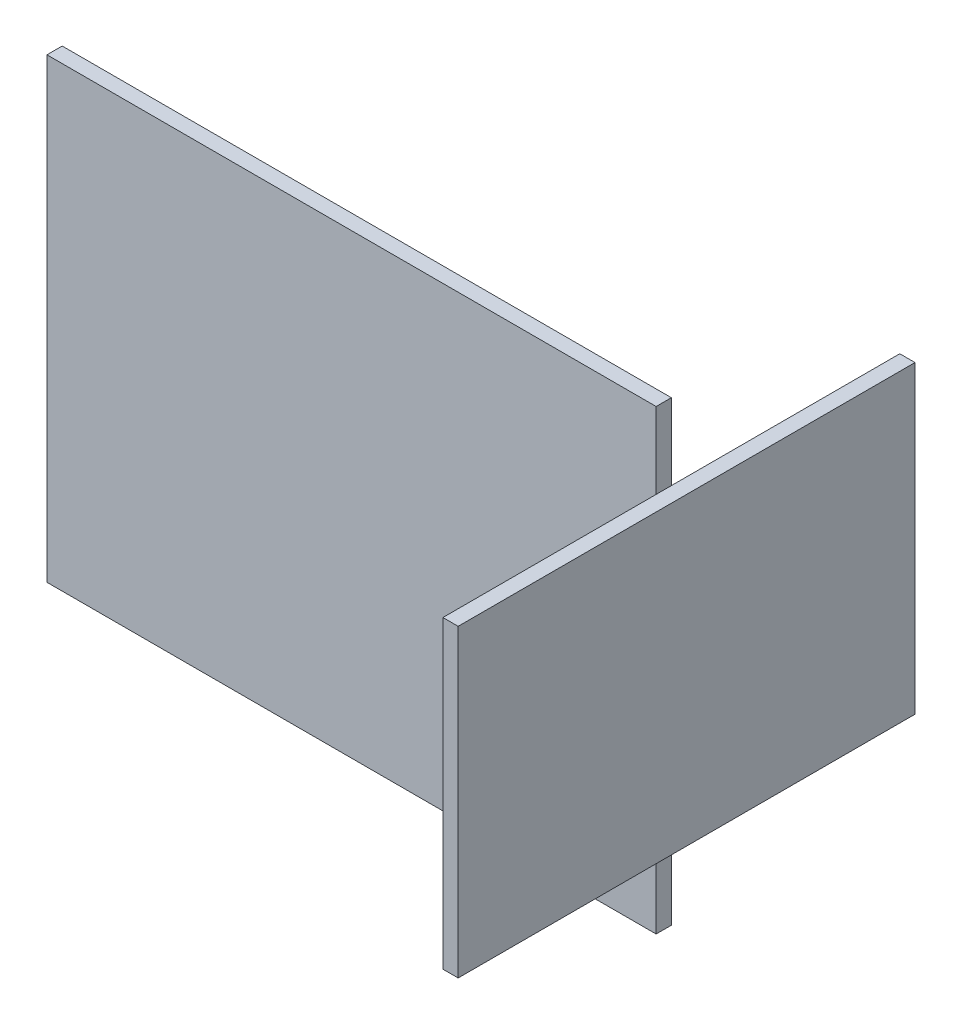
ISO-10303-21;
HEADER;
FILE_DESCRIPTION(('STEP AP214'),'2;1');
FILE_NAME('part.step','',(''),(''),'','','');
FILE_SCHEMA(('AUTOMOTIVE_DESIGN { 1 0 10303 214 1 1 1 1 }'));
ENDSEC;
DATA;
#1=APPLICATION_CONTEXT('core data for automotive mechanical design processes');
#2=APPLICATION_PROTOCOL_DEFINITION('international standard','automotive_design',2000,#1);
#3=PRODUCT_CONTEXT('',#1,'mechanical');
#4=PRODUCT('Part','Part','',(#3));
#5=PRODUCT_RELATED_PRODUCT_CATEGORY('part','',(#4));
#6=PRODUCT_DEFINITION_FORMATION('','',#4);
#7=PRODUCT_DEFINITION_CONTEXT('part definition',#1,'design');
#8=PRODUCT_DEFINITION('design','',#6,#7);
#9=PRODUCT_DEFINITION_SHAPE('','',#8);
#10=(LENGTH_UNIT() NAMED_UNIT(*) SI_UNIT(.MILLI.,.METRE.));
#11=(NAMED_UNIT(*) PLANE_ANGLE_UNIT() SI_UNIT($,.RADIAN.));
#12=(NAMED_UNIT(*) SI_UNIT($,.STERADIAN.) SOLID_ANGLE_UNIT());
#13=UNCERTAINTY_MEASURE_WITH_UNIT(LENGTH_MEASURE(1.E-05),#10,'distance_accuracy_value','');
#14=(GEOMETRIC_REPRESENTATION_CONTEXT(3) GLOBAL_UNCERTAINTY_ASSIGNED_CONTEXT((#13)) GLOBAL_UNIT_ASSIGNED_CONTEXT((#10,
#11,#12)) REPRESENTATION_CONTEXT('',''));
#15=CARTESIAN_POINT('',(0.,0.,0.));
#16=DIRECTION('',(0.,0.,1.));
#17=DIRECTION('',(1.,0.,0.));
#18=AXIS2_PLACEMENT_3D('',#15,#16,#17);
#19=CARTESIAN_POINT('',(40.,30.,2.));
#20=DIRECTION('',(-1.,0.,0.));
#21=DIRECTION('',(0.,0.,1.));
#22=AXIS2_PLACEMENT_3D('',#19,#20,#21);
#23=PLANE('',#22);
#24=DIRECTION('',(0.,0.,1.));
#25=VECTOR('',#24,1.);
#26=CARTESIAN_POINT('',(40.,20.,30.));
#27=LINE('',#26,#25);
#28=CARTESIAN_POINT('',(40.,20.,0.));
#29=VERTEX_POINT('',#28);
#30=CARTESIAN_POINT('',(40.,20.,2.));
#31=VERTEX_POINT('',#30);
#32=EDGE_CURVE('E11',#29,#31,#27,.T.);
#33=ORIENTED_EDGE('',*,*,#32,.F.);
#34=DIRECTION('',(0.,1.,0.));
#35=VECTOR('',#34,1.);
#36=CARTESIAN_POINT('',(40.,30.,0.));
#37=LINE('',#36,#35);
#38=CARTESIAN_POINT('',(40.,30.,0.));
#39=VERTEX_POINT('',#38);
#40=EDGE_CURVE('E161',#29,#39,#37,.T.);
#41=ORIENTED_EDGE('',*,*,#40,.T.);
#42=DIRECTION('',(0.,0.,-1.));
#43=VECTOR('',#42,1.);
#44=CARTESIAN_POINT('',(40.,30.,2.));
#45=LINE('',#44,#43);
#46=CARTESIAN_POINT('',(40.,30.,2.));
#47=VERTEX_POINT('',#46);
#48=EDGE_CURVE('E168',#47,#39,#45,.T.);
#49=ORIENTED_EDGE('',*,*,#48,.F.);
#50=DIRECTION('',(0.,1.,0.));
#51=VECTOR('',#50,1.);
#52=CARTESIAN_POINT('',(40.,30.,2.));
#53=LINE('',#52,#51);
#54=EDGE_CURVE('E52',#31,#47,#53,.T.);
#55=ORIENTED_EDGE('',*,*,#54,.F.);
#56=EDGE_LOOP('',(#33,#41,#49,#55));
#57=FACE_BOUND('',#56,.T.);
#58=ADVANCED_FACE('F33',(#57),#23,.F.);
#59=DIRECTION('',(0.,0.,-1.));
#60=VECTOR('',#59,1.);
#61=CARTESIAN_POINT('',(40.,-20.,30.));
#62=LINE('',#61,#60);
#63=CARTESIAN_POINT('',(40.,-20.,2.));
#64=VERTEX_POINT('',#63);
#65=CARTESIAN_POINT('',(40.,-20.,0.));
#66=VERTEX_POINT('',#65);
#67=EDGE_CURVE('E42',#64,#66,#62,.T.);
#68=ORIENTED_EDGE('',*,*,#67,.F.);
#69=CARTESIAN_POINT('',(40.,-30.,2.));
#70=VERTEX_POINT('',#69);
#71=EDGE_CURVE('E154',#70,#64,#53,.T.);
#72=ORIENTED_EDGE('',*,*,#71,.F.);
#73=DIRECTION('',(0.,0.,-1.));
#74=VECTOR('',#73,1.);
#75=CARTESIAN_POINT('',(40.,-30.,2.));
#76=LINE('',#75,#74);
#77=CARTESIAN_POINT('',(40.,-30.,0.));
#78=VERTEX_POINT('',#77);
#79=EDGE_CURVE('E170',#70,#78,#76,.T.);
#80=ORIENTED_EDGE('',*,*,#79,.T.);
#81=EDGE_CURVE('E162',#78,#66,#37,.T.);
#82=ORIENTED_EDGE('',*,*,#81,.T.);
#83=EDGE_LOOP('',(#68,#72,#80,#82));
#84=FACE_BOUND('',#83,.T.);
#85=ADVANCED_FACE('F227',(#84),#23,.F.);
#86=CARTESIAN_POINT('',(-40.,30.,2.));
#87=DIRECTION('',(1.,0.,0.));
#88=DIRECTION('',(0.,0.,-1.));
#89=AXIS2_PLACEMENT_3D('',#86,#87,#88);
#90=PLANE('',#89);
#91=DIRECTION('',(0.,-1.,0.));
#92=VECTOR('',#91,1.);
#93=CARTESIAN_POINT('',(-40.,30.,0.));
#94=LINE('',#93,#92);
#95=CARTESIAN_POINT('',(-40.,30.,0.));
#96=VERTEX_POINT('',#95);
#97=CARTESIAN_POINT('',(-40.,-30.,0.));
#98=VERTEX_POINT('',#97);
#99=EDGE_CURVE('E139',#96,#98,#94,.T.);
#100=ORIENTED_EDGE('',*,*,#99,.T.);
#101=DIRECTION('',(0.,0.,-1.));
#102=VECTOR('',#101,1.);
#103=CARTESIAN_POINT('',(-40.,-30.,2.));
#104=LINE('',#103,#102);
#105=CARTESIAN_POINT('',(-40.,-30.,2.));
#106=VERTEX_POINT('',#105);
#107=EDGE_CURVE('E37',#106,#98,#104,.T.);
#108=ORIENTED_EDGE('',*,*,#107,.F.);
#109=DIRECTION('',(0.,-1.,0.));
#110=VECTOR('',#109,1.);
#111=CARTESIAN_POINT('',(-40.,30.,2.));
#112=LINE('',#111,#110);
#113=CARTESIAN_POINT('',(-40.,30.,2.));
#114=VERTEX_POINT('',#113);
#115=EDGE_CURVE('E148',#114,#106,#112,.T.);
#116=ORIENTED_EDGE('',*,*,#115,.F.);
#117=DIRECTION('',(0.,0.,-1.));
#118=VECTOR('',#117,1.);
#119=CARTESIAN_POINT('',(-40.,30.,2.));
#120=LINE('',#119,#118);
#121=EDGE_CURVE('E158',#114,#96,#120,.T.);
#122=ORIENTED_EDGE('',*,*,#121,.T.);
#123=EDGE_LOOP('',(#100,#108,#116,#122));
#124=FACE_BOUND('',#123,.T.);
#125=ADVANCED_FACE('F35',(#124),#90,.F.);
#126=CARTESIAN_POINT('',(-40.,-30.,2.));
#127=DIRECTION('',(0.,1.,0.));
#128=DIRECTION('',(0.,0.,1.));
#129=AXIS2_PLACEMENT_3D('',#126,#127,#128);
#130=PLANE('',#129);
#131=DIRECTION('',(1.,0.,0.));
#132=VECTOR('',#131,1.);
#133=CARTESIAN_POINT('',(-40.,-30.,0.));
#134=LINE('',#133,#132);
#135=EDGE_CURVE('E142',#98,#78,#134,.T.);
#136=ORIENTED_EDGE('',*,*,#135,.T.);
#137=ORIENTED_EDGE('',*,*,#79,.F.);
#138=DIRECTION('',(1.,0.,0.));
#139=VECTOR('',#138,1.);
#140=CARTESIAN_POINT('',(-40.,-30.,2.));
#141=LINE('',#140,#139);
#142=EDGE_CURVE('E151',#106,#70,#141,.T.);
#143=ORIENTED_EDGE('',*,*,#142,.F.);
#144=ORIENTED_EDGE('',*,*,#107,.T.);
#145=EDGE_LOOP('',(#136,#137,#143,#144));
#146=FACE_BOUND('',#145,.T.);
#147=ADVANCED_FACE('F234',(#146),#130,.F.);
#148=CARTESIAN_POINT('',(-40.,30.,2.));
#149=DIRECTION('',(0.,-1.,0.));
#150=DIRECTION('',(0.,0.,-1.));
#151=AXIS2_PLACEMENT_3D('',#148,#149,#150);
#152=PLANE('',#151);
#153=DIRECTION('',(-1.,0.,0.));
#154=VECTOR('',#153,1.);
#155=CARTESIAN_POINT('',(-40.,30.,0.));
#156=LINE('',#155,#154);
#157=EDGE_CURVE('E152',#39,#96,#156,.T.);
#158=ORIENTED_EDGE('',*,*,#157,.T.);
#159=ORIENTED_EDGE('',*,*,#121,.F.);
#160=DIRECTION('',(-1.,0.,0.));
#161=VECTOR('',#160,1.);
#162=CARTESIAN_POINT('',(-40.,30.,2.));
#163=LINE('',#162,#161);
#164=EDGE_CURVE('E156',#47,#114,#163,.T.);
#165=ORIENTED_EDGE('',*,*,#164,.F.);
#166=ORIENTED_EDGE('',*,*,#48,.T.);
#167=EDGE_LOOP('',(#158,#159,#165,#166));
#168=FACE_BOUND('',#167,.T.);
#169=ADVANCED_FACE('F207',(#168),#152,.F.);
#170=CARTESIAN_POINT('',(0.,0.,2.));
#171=DIRECTION('',(0.,0.,1.));
#172=DIRECTION('',(1.,0.,0.));
#173=AXIS2_PLACEMENT_3D('',#170,#171,#172);
#174=PLANE('',#173);
#175=ORIENTED_EDGE('',*,*,#115,.T.);
#176=ORIENTED_EDGE('',*,*,#142,.T.);
#177=ORIENTED_EDGE('',*,*,#71,.T.);
#178=EDGE_CURVE('E157',#64,#31,#53,.T.);
#179=ORIENTED_EDGE('',*,*,#178,.T.);
#180=ORIENTED_EDGE('',*,*,#54,.T.);
#181=ORIENTED_EDGE('',*,*,#164,.T.);
#182=EDGE_LOOP('',(#175,#176,#177,#179,#180,#181));
#183=FACE_BOUND('',#182,.T.);
#184=ADVANCED_FACE('F214',(#183),#174,.T.);
#185=CARTESIAN_POINT('',(0.,0.,0.));
#186=DIRECTION('',(0.,0.,1.));
#187=DIRECTION('',(1.,0.,0.));
#188=AXIS2_PLACEMENT_3D('',#185,#186,#187);
#189=PLANE('',#188);
#190=ORIENTED_EDGE('',*,*,#99,.F.);
#191=ORIENTED_EDGE('',*,*,#157,.F.);
#192=ORIENTED_EDGE('',*,*,#40,.F.);
#193=EDGE_CURVE('E164',#66,#29,#37,.T.);
#194=ORIENTED_EDGE('',*,*,#193,.F.);
#195=ORIENTED_EDGE('',*,*,#81,.F.);
#196=ORIENTED_EDGE('',*,*,#135,.F.);
#197=EDGE_LOOP('',(#190,#191,#192,#194,#195,#196));
#198=FACE_BOUND('',#197,.T.);
#199=ADVANCED_FACE('F210',(#198),#189,.F.);
#200=CARTESIAN_POINT('',(40.,0.,0.));
#201=DIRECTION('',(1.,0.,0.));
#202=DIRECTION('',(0.,0.,-1.));
#203=AXIS2_PLACEMENT_3D('',#200,#201,#202);
#204=PLANE('',#203);
#205=CARTESIAN_POINT('',(40.,-20.,-30.));
#206=VERTEX_POINT('',#205);
#207=EDGE_CURVE('E179',#66,#206,#62,.T.);
#208=ORIENTED_EDGE('',*,*,#207,.F.);
#209=ORIENTED_EDGE('',*,*,#193,.T.);
#210=CARTESIAN_POINT('',(40.,20.,-30.));
#211=VERTEX_POINT('',#210);
#212=EDGE_CURVE('E44',#211,#29,#27,.T.);
#213=ORIENTED_EDGE('',*,*,#212,.F.);
#214=DIRECTION('',(0.,1.,0.));
#215=VECTOR('',#214,1.);
#216=CARTESIAN_POINT('',(40.,20.,-30.));
#217=LINE('',#216,#215);
#218=EDGE_CURVE('E182',#206,#211,#217,.T.);
#219=ORIENTED_EDGE('',*,*,#218,.F.);
#220=EDGE_LOOP('',(#208,#209,#213,#219));
#221=FACE_BOUND('',#220,.T.);
#222=ADVANCED_FACE('F200',(#221),#204,.F.);
#223=CARTESIAN_POINT('',(42.,20.,30.));
#224=DIRECTION('',(0.,0.,-1.));
#225=DIRECTION('',(-1.,0.,0.));
#226=AXIS2_PLACEMENT_3D('',#223,#224,#225);
#227=PLANE('',#226);
#228=DIRECTION('',(0.,-1.,0.));
#229=VECTOR('',#228,1.);
#230=CARTESIAN_POINT('',(40.,20.,30.));
#231=LINE('',#230,#229);
#232=CARTESIAN_POINT('',(40.,20.,30.));
#233=VERTEX_POINT('',#232);
#234=CARTESIAN_POINT('',(40.,-20.,30.));
#235=VERTEX_POINT('',#234);
#236=EDGE_CURVE('E138',#233,#235,#231,.T.);
#237=ORIENTED_EDGE('',*,*,#236,.T.);
#238=DIRECTION('',(-1.,0.,0.));
#239=VECTOR('',#238,1.);
#240=CARTESIAN_POINT('',(42.,-20.,30.));
#241=LINE('',#240,#239);
#242=CARTESIAN_POINT('',(42.,-20.,30.));
#243=VERTEX_POINT('',#242);
#244=EDGE_CURVE('E119',#243,#235,#241,.T.);
#245=ORIENTED_EDGE('',*,*,#244,.F.);
#246=DIRECTION('',(0.,-1.,0.));
#247=VECTOR('',#246,1.);
#248=CARTESIAN_POINT('',(42.,20.,30.));
#249=LINE('',#248,#247);
#250=CARTESIAN_POINT('',(42.,20.,30.));
#251=VERTEX_POINT('',#250);
#252=EDGE_CURVE('E126',#251,#243,#249,.T.);
#253=ORIENTED_EDGE('',*,*,#252,.F.);
#254=DIRECTION('',(-1.,0.,0.));
#255=VECTOR('',#254,1.);
#256=CARTESIAN_POINT('',(42.,20.,30.));
#257=LINE('',#256,#255);
#258=EDGE_CURVE('E186',#251,#233,#257,.T.);
#259=ORIENTED_EDGE('',*,*,#258,.T.);
#260=EDGE_LOOP('',(#237,#245,#253,#259));
#261=FACE_BOUND('',#260,.T.);
#262=ADVANCED_FACE('F136',(#261),#227,.F.);
#263=CARTESIAN_POINT('',(42.,-20.,30.));
#264=DIRECTION('',(0.,1.,0.));
#265=DIRECTION('',(0.,0.,1.));
#266=AXIS2_PLACEMENT_3D('',#263,#264,#265);
#267=PLANE('',#266);
#268=EDGE_CURVE('E178',#235,#64,#62,.T.);
#269=ORIENTED_EDGE('',*,*,#268,.T.);
#270=ORIENTED_EDGE('',*,*,#67,.T.);
#271=ORIENTED_EDGE('',*,*,#207,.T.);
#272=DIRECTION('',(-1.,0.,0.));
#273=VECTOR('',#272,1.);
#274=CARTESIAN_POINT('',(42.,-20.,-30.));
#275=LINE('',#274,#273);
#276=CARTESIAN_POINT('',(42.,-20.,-30.));
#277=VERTEX_POINT('',#276);
#278=EDGE_CURVE('E122',#277,#206,#275,.T.);
#279=ORIENTED_EDGE('',*,*,#278,.F.);
#280=DIRECTION('',(0.,0.,-1.));
#281=VECTOR('',#280,1.);
#282=CARTESIAN_POINT('',(42.,-20.,30.));
#283=LINE('',#282,#281);
#284=EDGE_CURVE('E114',#243,#277,#283,.T.);
#285=ORIENTED_EDGE('',*,*,#284,.F.);
#286=ORIENTED_EDGE('',*,*,#244,.T.);
#287=EDGE_LOOP('',(#269,#270,#271,#279,#285,#286));
#288=FACE_BOUND('',#287,.T.);
#289=ADVANCED_FACE('F117',(#288),#267,.F.);
#290=CARTESIAN_POINT('',(42.,20.,-30.));
#291=DIRECTION('',(0.,0.,1.));
#292=DIRECTION('',(1.,0.,0.));
#293=AXIS2_PLACEMENT_3D('',#290,#291,#292);
#294=PLANE('',#293);
#295=ORIENTED_EDGE('',*,*,#218,.T.);
#296=DIRECTION('',(-1.,0.,0.));
#297=VECTOR('',#296,1.);
#298=CARTESIAN_POINT('',(42.,20.,-30.));
#299=LINE('',#298,#297);
#300=CARTESIAN_POINT('',(42.,20.,-30.));
#301=VERTEX_POINT('',#300);
#302=EDGE_CURVE('E144',#301,#211,#299,.T.);
#303=ORIENTED_EDGE('',*,*,#302,.F.);
#304=DIRECTION('',(0.,1.,0.));
#305=VECTOR('',#304,1.);
#306=CARTESIAN_POINT('',(42.,20.,-30.));
#307=LINE('',#306,#305);
#308=EDGE_CURVE('E125',#277,#301,#307,.T.);
#309=ORIENTED_EDGE('',*,*,#308,.F.);
#310=ORIENTED_EDGE('',*,*,#278,.T.);
#311=EDGE_LOOP('',(#295,#303,#309,#310));
#312=FACE_BOUND('',#311,.T.);
#313=ADVANCED_FACE('F190',(#312),#294,.F.);
#314=CARTESIAN_POINT('',(42.,20.,30.));
#315=DIRECTION('',(0.,-1.,0.));
#316=DIRECTION('',(0.,0.,-1.));
#317=AXIS2_PLACEMENT_3D('',#314,#315,#316);
#318=PLANE('',#317);
#319=ORIENTED_EDGE('',*,*,#212,.T.);
#320=ORIENTED_EDGE('',*,*,#32,.T.);
#321=EDGE_CURVE('E45',#31,#233,#27,.T.);
#322=ORIENTED_EDGE('',*,*,#321,.T.);
#323=ORIENTED_EDGE('',*,*,#258,.F.);
#324=DIRECTION('',(0.,0.,1.));
#325=VECTOR('',#324,1.);
#326=CARTESIAN_POINT('',(42.,20.,30.));
#327=LINE('',#326,#325);
#328=EDGE_CURVE('E131',#301,#251,#327,.T.);
#329=ORIENTED_EDGE('',*,*,#328,.F.);
#330=ORIENTED_EDGE('',*,*,#302,.T.);
#331=EDGE_LOOP('',(#319,#320,#322,#323,#329,#330));
#332=FACE_BOUND('',#331,.T.);
#333=ADVANCED_FACE('F195',(#332),#318,.F.);
#334=CARTESIAN_POINT('',(42.,0.,0.));
#335=DIRECTION('',(1.,0.,0.));
#336=DIRECTION('',(0.,0.,-1.));
#337=AXIS2_PLACEMENT_3D('',#334,#335,#336);
#338=PLANE('',#337);
#339=ORIENTED_EDGE('',*,*,#252,.T.);
#340=ORIENTED_EDGE('',*,*,#284,.T.);
#341=ORIENTED_EDGE('',*,*,#308,.T.);
#342=ORIENTED_EDGE('',*,*,#328,.T.);
#343=EDGE_LOOP('',(#339,#340,#341,#342));
#344=FACE_BOUND('',#343,.T.);
#345=ADVANCED_FACE('F129',(#344),#338,.T.);
#346=ORIENTED_EDGE('',*,*,#178,.F.);
#347=ORIENTED_EDGE('',*,*,#268,.F.);
#348=ORIENTED_EDGE('',*,*,#236,.F.);
#349=ORIENTED_EDGE('',*,*,#321,.F.);
#350=EDGE_LOOP('',(#346,#347,#348,#349));
#351=FACE_BOUND('',#350,.T.);
#352=ADVANCED_FACE('F217',(#351),#204,.F.);
#353=CLOSED_SHELL('',(#58,#85,#125,#147,#169,#184,#199,#222,#262,#289,#313,#333,#345,#352));
#354=MANIFOLD_SOLID_BREP('B2',#353);
#355=ADVANCED_BREP_SHAPE_REPRESENTATION('',(#18,#354),#14);
#356=SHAPE_DEFINITION_REPRESENTATION(#9,#355);
ENDSEC;
END-ISO-10303-21;
